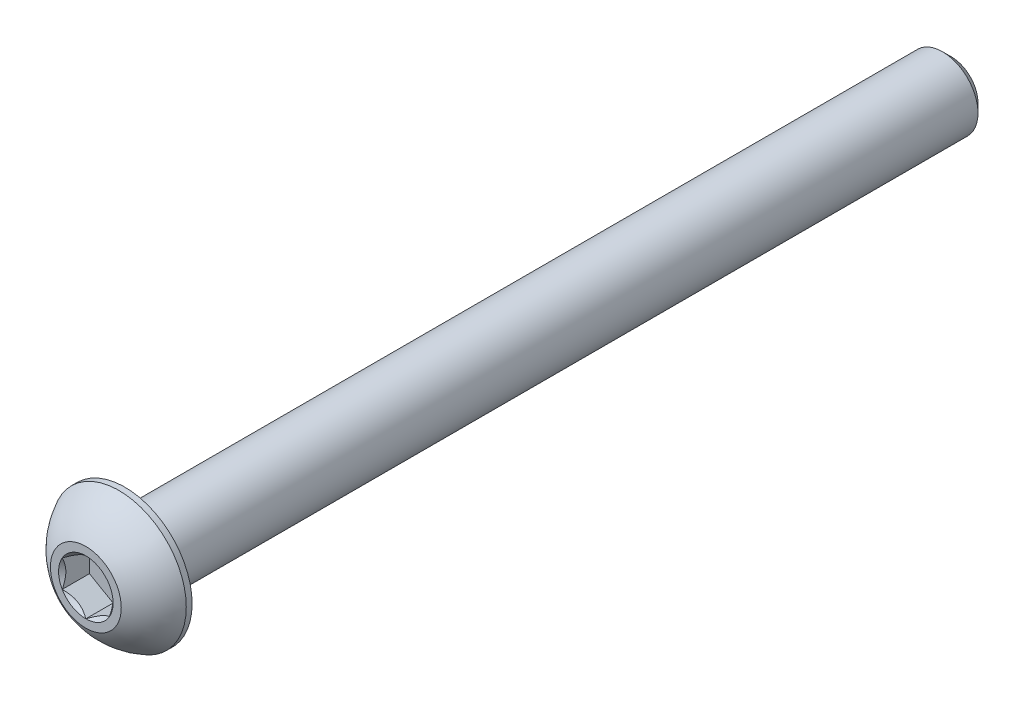
ISO-10303-21;
HEADER;
FILE_DESCRIPTION(('STEP AP214'),'2;1');
FILE_NAME('part.step','',(''),(''),'','','');
FILE_SCHEMA(('AUTOMOTIVE_DESIGN { 1 0 10303 214 1 1 1 1 }'));
ENDSEC;
DATA;
#1=APPLICATION_CONTEXT('core data for automotive mechanical design processes');
#2=APPLICATION_PROTOCOL_DEFINITION('international standard','automotive_design',2000,#1);
#3=PRODUCT_CONTEXT('',#1,'mechanical');
#4=PRODUCT('Part','Part','',(#3));
#5=PRODUCT_RELATED_PRODUCT_CATEGORY('part','',(#4));
#6=PRODUCT_DEFINITION_FORMATION('','',#4);
#7=PRODUCT_DEFINITION_CONTEXT('part definition',#1,'design');
#8=PRODUCT_DEFINITION('design','',#6,#7);
#9=PRODUCT_DEFINITION_SHAPE('','',#8);
#10=(LENGTH_UNIT() NAMED_UNIT(*) SI_UNIT(.MILLI.,.METRE.));
#11=(NAMED_UNIT(*) PLANE_ANGLE_UNIT() SI_UNIT($,.RADIAN.));
#12=(NAMED_UNIT(*) SI_UNIT($,.STERADIAN.) SOLID_ANGLE_UNIT());
#13=UNCERTAINTY_MEASURE_WITH_UNIT(LENGTH_MEASURE(1.E-05),#10,'distance_accuracy_value','');
#14=(GEOMETRIC_REPRESENTATION_CONTEXT(3) GLOBAL_UNCERTAINTY_ASSIGNED_CONTEXT((#13)) GLOBAL_UNIT_ASSIGNED_CONTEXT((#10,
#11,#12)) REPRESENTATION_CONTEXT('',''));
#15=CARTESIAN_POINT('',(0.,0.,0.));
#16=DIRECTION('',(0.,0.,1.));
#17=DIRECTION('',(1.,0.,0.));
#18=AXIS2_PLACEMENT_3D('',#15,#16,#17);
#19=CARTESIAN_POINT('',(0.,-1.15470053837925,-1.155));
#20=DIRECTION('',(0.5,-0.866025403784439,0.));
#21=DIRECTION('',(0.,0.,-1.));
#22=AXIS2_PLACEMENT_3D('',#19,#20,#21);
#23=PLANE('',#22);
#24=DIRECTION('',(0.,0.,1.));
#25=VECTOR('',#24,1.);
#26=CARTESIAN_POINT('',(0.,-1.15470053837925,-1.155));
#27=LINE('',#26,#25);
#28=CARTESIAN_POINT('',(0.,-1.15470053837925,-1.155));
#29=VERTEX_POINT('',#28);
#30=CARTESIAN_POINT('',(0.,-1.15470053837925,0.));
#31=VERTEX_POINT('',#30);
#32=EDGE_CURVE('E11',#29,#31,#27,.T.);
#33=ORIENTED_EDGE('',*,*,#32,.T.);
#34=CARTESIAN_POINT('',(0.,-1.15470053837922,0.));
#35=CARTESIAN_POINT('',(0.500000000000001,-0.866025403784439,-0.288675134594791));
#36=CARTESIAN_POINT('',(0.999999999999949,-0.577350269189654,0.));
#37=(BOUNDED_CURVE() B_SPLINE_CURVE(2,(#34,#35,#36),.UNSPECIFIED.,.F.,
.F.) B_SPLINE_CURVE_WITH_KNOTS((3,3),(-0.321867155116299,-0.124274873543865),
.UNSPECIFIED.) CURVE() GEOMETRIC_REPRESENTATION_ITEM() RATIONAL_B_SPLINE_CURVE((1.46410161513778,
1.69059892324148,1.46410161513778)) REPRESENTATION_ITEM(''));
#38=CARTESIAN_POINT('',(1.,-0.577350269189626,0.));
#39=VERTEX_POINT('',#38);
#40=EDGE_CURVE('E102',#31,#39,#37,.T.);
#41=ORIENTED_EDGE('',*,*,#40,.T.);
#42=DIRECTION('',(0.,0.,1.));
#43=VECTOR('',#42,1.);
#44=CARTESIAN_POINT('',(1.,-0.577350269189626,-1.155));
#45=LINE('',#44,#43);
#46=CARTESIAN_POINT('',(1.,-0.577350269189626,-1.155));
#47=VERTEX_POINT('',#46);
#48=EDGE_CURVE('E87',#47,#39,#45,.T.);
#49=ORIENTED_EDGE('',*,*,#48,.F.);
#50=DIRECTION('',(0.866025403784439,0.5,0.));
#51=VECTOR('',#50,1.);
#52=CARTESIAN_POINT('',(0.,-1.15470053837925,-1.155));
#53=LINE('',#52,#51);
#54=EDGE_CURVE('E107',#29,#47,#53,.T.);
#55=ORIENTED_EDGE('',*,*,#54,.F.);
#56=EDGE_LOOP('',(#33,#41,#49,#55));
#57=FACE_BOUND('',#56,.T.);
#58=ADVANCED_FACE('F17',(#57),#23,.F.);
#59=CARTESIAN_POINT('',(-1.,-0.577350269189626,-1.155));
#60=DIRECTION('',(-0.5,-0.866025403784439,0.));
#61=DIRECTION('',(-0.866025403784439,0.5,0.));
#62=AXIS2_PLACEMENT_3D('',#59,#60,#61);
#63=PLANE('',#62);
#64=DIRECTION('',(0.,0.,1.));
#65=VECTOR('',#64,1.);
#66=CARTESIAN_POINT('',(-1.,-0.577350269189626,-1.155));
#67=LINE('',#66,#65);
#68=CARTESIAN_POINT('',(-1.,-0.577350269189626,-1.155));
#69=VERTEX_POINT('',#68);
#70=CARTESIAN_POINT('',(-1.,-0.577350269189626,0.));
#71=VERTEX_POINT('',#70);
#72=EDGE_CURVE('E25',#69,#71,#67,.T.);
#73=ORIENTED_EDGE('',*,*,#72,.T.);
#74=CARTESIAN_POINT('',(-0.999999999999948,-0.577350269189655,0.));
#75=CARTESIAN_POINT('',(-0.5,-0.866025403784439,-0.28867513459479));
#76=CARTESIAN_POINT('',(0.,-1.15470053837922,0.));
#77=(BOUNDED_CURVE() B_SPLINE_CURVE(2,(#74,#75,#76),.UNSPECIFIED.,.F.,
.F.) B_SPLINE_CURVE_WITH_KNOTS((3,3),(-0.321867155116299,-0.124274873543865),
.UNSPECIFIED.) CURVE() GEOMETRIC_REPRESENTATION_ITEM() RATIONAL_B_SPLINE_CURVE((1.46410161513778,
1.69059892324148,1.46410161513778)) REPRESENTATION_ITEM(''));
#78=EDGE_CURVE('E108',#71,#31,#77,.T.);
#79=ORIENTED_EDGE('',*,*,#78,.T.);
#80=ORIENTED_EDGE('',*,*,#32,.F.);
#81=DIRECTION('',(0.866025403784439,-0.5,0.));
#82=VECTOR('',#81,1.);
#83=CARTESIAN_POINT('',(-1.,-0.577350269189626,-1.155));
#84=LINE('',#83,#82);
#85=EDGE_CURVE('E99',#69,#29,#84,.T.);
#86=ORIENTED_EDGE('',*,*,#85,.F.);
#87=EDGE_LOOP('',(#73,#79,#80,#86));
#88=FACE_BOUND('',#87,.T.);
#89=ADVANCED_FACE('F247',(#88),#63,.F.);
#90=CARTESIAN_POINT('',(-1.,0.577350269189626,-1.155));
#91=DIRECTION('',(-1.,0.,0.));
#92=DIRECTION('',(0.,0.,1.));
#93=AXIS2_PLACEMENT_3D('',#90,#91,#92);
#94=PLANE('',#93);
#95=DIRECTION('',(0.,0.,1.));
#96=VECTOR('',#95,1.);
#97=CARTESIAN_POINT('',(-1.,0.577350269189626,-1.155));
#98=LINE('',#97,#96);
#99=CARTESIAN_POINT('',(-1.,0.577350269189626,-1.155));
#100=VERTEX_POINT('',#99);
#101=CARTESIAN_POINT('',(-1.,0.577350269189626,0.));
#102=VERTEX_POINT('',#101);
#103=EDGE_CURVE('E46',#100,#102,#98,.T.);
#104=ORIENTED_EDGE('',*,*,#103,.T.);
#105=CARTESIAN_POINT('',(-1.,0.577350269189569,0.));
#106=CARTESIAN_POINT('',(-1.,0.,-0.28867513459479));
#107=CARTESIAN_POINT('',(-1.,-0.577350269189568,0.));
#108=(BOUNDED_CURVE() B_SPLINE_CURVE(2,(#105,#106,#107),.UNSPECIFIED.,.F.,
.F.) B_SPLINE_CURVE_WITH_KNOTS((3,3),(-0.3218671551163,-0.124274873543865),
.UNSPECIFIED.) CURVE() GEOMETRIC_REPRESENTATION_ITEM() RATIONAL_B_SPLINE_CURVE((1.46410161513777,
1.69059892324148,1.46410161513777)) REPRESENTATION_ITEM(''));
#109=EDGE_CURVE('E200',#102,#71,#108,.T.);
#110=ORIENTED_EDGE('',*,*,#109,.T.);
#111=ORIENTED_EDGE('',*,*,#72,.F.);
#112=DIRECTION('',(0.,-1.,0.));
#113=VECTOR('',#112,1.);
#114=CARTESIAN_POINT('',(-1.,0.577350269189626,-1.155));
#115=LINE('',#114,#113);
#116=EDGE_CURVE('E173',#100,#69,#115,.T.);
#117=ORIENTED_EDGE('',*,*,#116,.F.);
#118=EDGE_LOOP('',(#104,#110,#111,#117));
#119=FACE_BOUND('',#118,.T.);
#120=ADVANCED_FACE('F251',(#119),#94,.F.);
#121=CARTESIAN_POINT('',(0.,1.15470053837925,-1.155));
#122=DIRECTION('',(-0.5,0.866025403784439,0.));
#123=DIRECTION('',(0.,0.,1.));
#124=AXIS2_PLACEMENT_3D('',#121,#122,#123);
#125=PLANE('',#124);
#126=DIRECTION('',(0.,0.,1.));
#127=VECTOR('',#126,1.);
#128=CARTESIAN_POINT('',(0.,1.15470053837925,-1.155));
#129=LINE('',#128,#127);
#130=CARTESIAN_POINT('',(0.,1.15470053837925,-1.155));
#131=VERTEX_POINT('',#130);
#132=CARTESIAN_POINT('',(0.,1.15470053837925,0.));
#133=VERTEX_POINT('',#132);
#134=EDGE_CURVE('E238',#131,#133,#129,.T.);
#135=ORIENTED_EDGE('',*,*,#134,.T.);
#136=CARTESIAN_POINT('',(0.,1.15470053837922,0.));
#137=CARTESIAN_POINT('',(-0.500000000000001,0.866025403784439,-0.288675134594791));
#138=CARTESIAN_POINT('',(-0.999999999999951,0.577350269189654,0.));
#139=(BOUNDED_CURVE() B_SPLINE_CURVE(2,(#136,#137,#138),.UNSPECIFIED.,.F.,
.F.) B_SPLINE_CURVE_WITH_KNOTS((3,3),(-0.3218671551163,-0.124274873543865),
.UNSPECIFIED.) CURVE() GEOMETRIC_REPRESENTATION_ITEM() RATIONAL_B_SPLINE_CURVE((1.46410161513778,
1.69059892324148,1.46410161513778)) REPRESENTATION_ITEM(''));
#140=EDGE_CURVE('E184',#133,#102,#139,.T.);
#141=ORIENTED_EDGE('',*,*,#140,.T.);
#142=ORIENTED_EDGE('',*,*,#103,.F.);
#143=DIRECTION('',(-0.866025403784439,-0.5,0.));
#144=VECTOR('',#143,1.);
#145=CARTESIAN_POINT('',(0.,1.15470053837925,-1.155));
#146=LINE('',#145,#144);
#147=EDGE_CURVE('E169',#131,#100,#146,.T.);
#148=ORIENTED_EDGE('',*,*,#147,.F.);
#149=EDGE_LOOP('',(#135,#141,#142,#148));
#150=FACE_BOUND('',#149,.T.);
#151=ADVANCED_FACE('F274',(#150),#125,.F.);
#152=CARTESIAN_POINT('',(1.,0.577350269189626,-1.155));
#153=DIRECTION('',(0.5,0.866025403784439,0.));
#154=DIRECTION('',(0.,0.,-1.));
#155=AXIS2_PLACEMENT_3D('',#152,#153,#154);
#156=PLANE('',#155);
#157=DIRECTION('',(0.,0.,1.));
#158=VECTOR('',#157,1.);
#159=CARTESIAN_POINT('',(1.,0.577350269189626,-1.155));
#160=LINE('',#159,#158);
#161=CARTESIAN_POINT('',(1.,0.577350269189626,-1.155));
#162=VERTEX_POINT('',#161);
#163=CARTESIAN_POINT('',(1.,0.577350269189626,0.));
#164=VERTEX_POINT('',#163);
#165=EDGE_CURVE('E98',#162,#164,#160,.T.);
#166=ORIENTED_EDGE('',*,*,#165,.T.);
#167=CARTESIAN_POINT('',(0.999999999999952,0.577350269189653,0.));
#168=CARTESIAN_POINT('',(0.5,0.866025403784439,-0.288675134594791));
#169=CARTESIAN_POINT('',(0.,1.15470053837922,0.));
#170=(BOUNDED_CURVE() B_SPLINE_CURVE(2,(#167,#168,#169),.UNSPECIFIED.,.F.,
.F.) B_SPLINE_CURVE_WITH_KNOTS((3,3),(-0.3218671551163,-0.124274873543865),
.UNSPECIFIED.) CURVE() GEOMETRIC_REPRESENTATION_ITEM() RATIONAL_B_SPLINE_CURVE((1.46410161513778,
1.69059892324148,1.46410161513778)) REPRESENTATION_ITEM(''));
#171=EDGE_CURVE('E178',#164,#133,#170,.T.);
#172=ORIENTED_EDGE('',*,*,#171,.T.);
#173=ORIENTED_EDGE('',*,*,#134,.F.);
#174=DIRECTION('',(-0.866025403784439,0.5,0.));
#175=VECTOR('',#174,1.);
#176=CARTESIAN_POINT('',(1.,0.577350269189626,-1.155));
#177=LINE('',#176,#175);
#178=EDGE_CURVE('E174',#162,#131,#177,.T.);
#179=ORIENTED_EDGE('',*,*,#178,.F.);
#180=EDGE_LOOP('',(#166,#172,#173,#179));
#181=FACE_BOUND('',#180,.T.);
#182=ADVANCED_FACE('F278',(#181),#156,.F.);
#183=CARTESIAN_POINT('',(1.,-0.577350269189626,-1.155));
#184=DIRECTION('',(1.,0.,0.));
#185=DIRECTION('',(0.,1.,0.));
#186=AXIS2_PLACEMENT_3D('',#183,#184,#185);
#187=PLANE('',#186);
#188=ORIENTED_EDGE('',*,*,#48,.T.);
#189=CARTESIAN_POINT('',(1.,-0.577350269189568,0.));
#190=CARTESIAN_POINT('',(1.,0.,-0.28867513459479));
#191=CARTESIAN_POINT('',(1.,0.577350269189568,0.));
#192=(BOUNDED_CURVE() B_SPLINE_CURVE(2,(#189,#190,#191),.UNSPECIFIED.,.F.,
.F.) B_SPLINE_CURVE_WITH_KNOTS((3,3),(-0.321867155116299,-0.124274873543865),
.UNSPECIFIED.) CURVE() GEOMETRIC_REPRESENTATION_ITEM() RATIONAL_B_SPLINE_CURVE((1.46410161513777,
1.69059892324148,1.46410161513777)) REPRESENTATION_ITEM(''));
#193=EDGE_CURVE('E91',#39,#164,#192,.T.);
#194=ORIENTED_EDGE('',*,*,#193,.T.);
#195=ORIENTED_EDGE('',*,*,#165,.F.);
#196=DIRECTION('',(0.,1.,0.));
#197=VECTOR('',#196,1.);
#198=CARTESIAN_POINT('',(1.,-0.577350269189626,-1.155));
#199=LINE('',#198,#197);
#200=EDGE_CURVE('E93',#47,#162,#199,.T.);
#201=ORIENTED_EDGE('',*,*,#200,.F.);
#202=EDGE_LOOP('',(#188,#194,#195,#201));
#203=FACE_BOUND('',#202,.T.);
#204=ADVANCED_FACE('F89',(#203),#187,.F.);
#205=CARTESIAN_POINT('',(1.,-0.577350269189625,-1.155));
#206=DIRECTION('',(0.,0.,1.));
#207=DIRECTION('',(1.,0.,0.));
#208=AXIS2_PLACEMENT_3D('',#205,#206,#207);
#209=PLANE('',#208);
#210=ORIENTED_EDGE('',*,*,#54,.T.);
#211=ORIENTED_EDGE('',*,*,#200,.T.);
#212=ORIENTED_EDGE('',*,*,#178,.T.);
#213=ORIENTED_EDGE('',*,*,#147,.T.);
#214=ORIENTED_EDGE('',*,*,#116,.T.);
#215=ORIENTED_EDGE('',*,*,#85,.T.);
#216=EDGE_LOOP('',(#210,#211,#212,#213,#214,#215));
#217=FACE_BOUND('',#216,.T.);
#218=ADVANCED_FACE('F296',(#217),#209,.T.);
#219=CARTESIAN_POINT('',(0.,0.,0.));
#220=DIRECTION('',(0.,0.,1.));
#221=DIRECTION('',(1.,0.,0.));
#222=AXIS2_PLACEMENT_3D('',#219,#220,#221);
#223=CONICAL_SURFACE('',#222,1.15470053837925,0.78539816339745);
#224=CARTESIAN_POINT('',(0.,0.,0.));
#225=DIRECTION('',(0.,0.,1.));
#226=DIRECTION('',(1.,0.,0.));
#227=AXIS2_PLACEMENT_3D('',#224,#225,#226);
#228=CIRCLE('',#227,1.15470053837925);
#229=EDGE_CURVE('E111',#31,#39,#228,.T.);
#230=ORIENTED_EDGE('',*,*,#229,.T.);
#231=ORIENTED_EDGE('',*,*,#40,.F.);
#232=EDGE_LOOP('',(#230,#231));
#233=FACE_BOUND('',#232,.T.);
#234=ADVANCED_FACE('F113',(#233),#223,.F.);
#235=CARTESIAN_POINT('',(0.,0.,0.));
#236=DIRECTION('',(0.,0.,1.));
#237=DIRECTION('',(1.,0.,0.));
#238=AXIS2_PLACEMENT_3D('',#235,#236,#237);
#239=CONICAL_SURFACE('',#238,1.15470053837925,0.78539816339745);
#240=CARTESIAN_POINT('',(0.,0.,0.));
#241=DIRECTION('',(0.,0.,1.));
#242=DIRECTION('',(1.,0.,0.));
#243=AXIS2_PLACEMENT_3D('',#240,#241,#242);
#244=CIRCLE('',#243,1.15470053837925);
#245=EDGE_CURVE('E117',#71,#31,#244,.T.);
#246=ORIENTED_EDGE('',*,*,#245,.T.);
#247=ORIENTED_EDGE('',*,*,#78,.F.);
#248=EDGE_LOOP('',(#246,#247));
#249=FACE_BOUND('',#248,.T.);
#250=ADVANCED_FACE('F249',(#249),#239,.F.);
#251=CARTESIAN_POINT('',(0.,0.,0.));
#252=DIRECTION('',(0.,0.,1.));
#253=DIRECTION('',(-1.,0.,0.));
#254=AXIS2_PLACEMENT_3D('',#251,#252,#253);
#255=CONICAL_SURFACE('',#254,1.15470053837925,0.78539816339745);
#256=CARTESIAN_POINT('',(0.,0.,0.));
#257=DIRECTION('',(0.,0.,1.));
#258=DIRECTION('',(1.,0.,0.));
#259=AXIS2_PLACEMENT_3D('',#256,#257,#258);
#260=CIRCLE('',#259,1.15470053837925);
#261=EDGE_CURVE('E153',#102,#71,#260,.T.);
#262=ORIENTED_EDGE('',*,*,#261,.T.);
#263=ORIENTED_EDGE('',*,*,#109,.F.);
#264=EDGE_LOOP('',(#262,#263));
#265=FACE_BOUND('',#264,.T.);
#266=ADVANCED_FACE('F253',(#265),#255,.F.);
#267=CARTESIAN_POINT('',(0.,0.,0.));
#268=DIRECTION('',(0.,0.,1.));
#269=DIRECTION('',(1.,0.,0.));
#270=AXIS2_PLACEMENT_3D('',#267,#268,#269);
#271=CONICAL_SURFACE('',#270,1.15470053837925,0.78539816339745);
#272=CARTESIAN_POINT('',(0.,0.,0.));
#273=DIRECTION('',(0.,0.,1.));
#274=DIRECTION('',(1.,0.,0.));
#275=AXIS2_PLACEMENT_3D('',#272,#273,#274);
#276=CIRCLE('',#275,1.15470053837925);
#277=EDGE_CURVE('E149',#133,#102,#276,.T.);
#278=ORIENTED_EDGE('',*,*,#277,.T.);
#279=ORIENTED_EDGE('',*,*,#140,.F.);
#280=EDGE_LOOP('',(#278,#279));
#281=FACE_BOUND('',#280,.T.);
#282=ADVANCED_FACE('F255',(#281),#271,.F.);
#283=CARTESIAN_POINT('',(0.,0.,0.));
#284=DIRECTION('',(0.,0.,1.));
#285=DIRECTION('',(1.,0.,0.));
#286=AXIS2_PLACEMENT_3D('',#283,#284,#285);
#287=CONICAL_SURFACE('',#286,1.15470053837925,0.78539816339745);
#288=CARTESIAN_POINT('',(0.,0.,0.));
#289=DIRECTION('',(0.,0.,1.));
#290=DIRECTION('',(1.,0.,0.));
#291=AXIS2_PLACEMENT_3D('',#288,#289,#290);
#292=CIRCLE('',#291,1.15470053837925);
#293=EDGE_CURVE('E118',#164,#133,#292,.T.);
#294=ORIENTED_EDGE('',*,*,#293,.T.);
#295=ORIENTED_EDGE('',*,*,#171,.F.);
#296=EDGE_LOOP('',(#294,#295));
#297=FACE_BOUND('',#296,.T.);
#298=ADVANCED_FACE('F262',(#297),#287,.F.);
#299=CARTESIAN_POINT('',(0.,-2.85,-1.65));
#300=DIRECTION('',(0.,0.,1.));
#301=DIRECTION('',(1.,0.,0.));
#302=AXIS2_PLACEMENT_3D('',#299,#300,#301);
#303=PLANE('',#302);
#304=CARTESIAN_POINT('',(0.,0.,-1.65));
#305=DIRECTION('',(0.,0.,-1.));
#306=DIRECTION('',(1.,0.,0.));
#307=AXIS2_PLACEMENT_3D('',#304,#305,#306);
#308=CIRCLE('',#307,1.5);
#309=CARTESIAN_POINT('',(1.5,0.,-1.65));
#310=VERTEX_POINT('',#309);
#311=EDGE_CURVE('E160',#310,#310,#308,.T.);
#312=ORIENTED_EDGE('',*,*,#311,.F.);
#313=EDGE_LOOP('',(#312));
#314=FACE_BOUND('',#313,.T.);
#315=CARTESIAN_POINT('',(0.,0.,-1.65));
#316=DIRECTION('',(0.,0.,1.));
#317=DIRECTION('',(1.,0.,0.));
#318=AXIS2_PLACEMENT_3D('',#315,#316,#317);
#319=CIRCLE('',#318,2.85);
#320=CARTESIAN_POINT('',(2.85,0.,-1.65));
#321=VERTEX_POINT('',#320);
#322=EDGE_CURVE('E141',#321,#321,#319,.T.);
#323=ORIENTED_EDGE('',*,*,#322,.F.);
#324=EDGE_LOOP('',(#323));
#325=FACE_BOUND('',#324,.T.);
#326=ADVANCED_FACE('F289',(#314,#325),#303,.F.);
#327=CARTESIAN_POINT('',(0.,-1.5,0.));
#328=DIRECTION('',(0.,0.,-1.));
#329=DIRECTION('',(0.,-1.,0.));
#330=AXIS2_PLACEMENT_3D('',#327,#328,#329);
#331=PLANE('',#330);
#332=ORIENTED_EDGE('',*,*,#261,.F.);
#333=ORIENTED_EDGE('',*,*,#277,.F.);
#334=ORIENTED_EDGE('',*,*,#293,.F.);
#335=CARTESIAN_POINT('',(0.,0.,0.));
#336=DIRECTION('',(0.,0.,1.));
#337=DIRECTION('',(1.,0.,0.));
#338=AXIS2_PLACEMENT_3D('',#335,#336,#337);
#339=CIRCLE('',#338,1.15470053837925);
#340=EDGE_CURVE('E122',#39,#164,#339,.T.);
#341=ORIENTED_EDGE('',*,*,#340,.F.);
#342=ORIENTED_EDGE('',*,*,#229,.F.);
#343=ORIENTED_EDGE('',*,*,#245,.F.);
#344=EDGE_LOOP('',(#332,#333,#334,#341,#342,#343));
#345=FACE_BOUND('',#344,.T.);
#346=CARTESIAN_POINT('',(0.,0.,0.));
#347=DIRECTION('',(0.,0.,1.));
#348=DIRECTION('',(1.,0.,0.));
#349=AXIS2_PLACEMENT_3D('',#346,#347,#348);
#350=CIRCLE('',#349,1.5);
#351=CARTESIAN_POINT('',(1.5,0.,0.));
#352=VERTEX_POINT('',#351);
#353=EDGE_CURVE('E147',#352,#352,#350,.T.);
#354=ORIENTED_EDGE('',*,*,#353,.T.);
#355=EDGE_LOOP('',(#354));
#356=FACE_BOUND('',#355,.T.);
#357=ADVANCED_FACE('F124',(#345,#356),#331,.F.);
#358=CARTESIAN_POINT('',(0.,-1.5,-36.65));
#359=DIRECTION('',(0.,0.,-1.));
#360=DIRECTION('',(-1.,0.,0.));
#361=AXIS2_PLACEMENT_3D('',#358,#359,#360);
#362=PLANE('',#361);
#363=CARTESIAN_POINT('',(0.,0.,-36.65));
#364=DIRECTION('',(0.,0.,-1.));
#365=DIRECTION('',(0.,1.,0.));
#366=AXIS2_PLACEMENT_3D('',#363,#364,#365);
#367=CIRCLE('',#366,1.125);
#368=CARTESIAN_POINT('',(0.,1.125,-36.65));
#369=VERTEX_POINT('',#368);
#370=EDGE_CURVE('E167',#369,#369,#367,.T.);
#371=ORIENTED_EDGE('',*,*,#370,.T.);
#372=EDGE_LOOP('',(#371));
#373=FACE_BOUND('',#372,.T.);
#374=ADVANCED_FACE('F315',(#373),#362,.T.);
#375=CARTESIAN_POINT('',(0.,0.,-36.65));
#376=DIRECTION('',(0.,0.,-1.));
#377=DIRECTION('',(0.,1.,0.));
#378=AXIS2_PLACEMENT_3D('',#375,#376,#377);
#379=CYLINDRICAL_SURFACE('',#378,1.5);
#380=ORIENTED_EDGE('',*,*,#311,.T.);
#381=EDGE_LOOP('',(#380));
#382=FACE_BOUND('',#381,.T.);
#383=CARTESIAN_POINT('',(0.,0.,-36.275));
#384=DIRECTION('',(0.,0.,1.));
#385=DIRECTION('',(0.,1.,0.));
#386=AXIS2_PLACEMENT_3D('',#383,#384,#385);
#387=CIRCLE('',#386,1.5);
#388=CARTESIAN_POINT('',(0.,1.5,-36.275));
#389=VERTEX_POINT('',#388);
#390=EDGE_CURVE('E164',#389,#389,#387,.T.);
#391=ORIENTED_EDGE('',*,*,#390,.T.);
#392=EDGE_LOOP('',(#391));
#393=FACE_BOUND('',#392,.T.);
#394=ADVANCED_FACE('F318',(#382,#393),#379,.T.);
#395=CARTESIAN_POINT('',(0.,0.,-36.65));
#396=DIRECTION('',(0.,0.,1.));
#397=DIRECTION('',(0.,-1.,0.));
#398=AXIS2_PLACEMENT_3D('',#395,#396,#397);
#399=CONICAL_SURFACE('',#398,1.125,0.78539816339745);
#400=ORIENTED_EDGE('',*,*,#370,.F.);
#401=EDGE_LOOP('',(#400));
#402=FACE_BOUND('',#401,.T.);
#403=ORIENTED_EDGE('',*,*,#390,.F.);
#404=EDGE_LOOP('',(#403));
#405=FACE_BOUND('',#404,.T.);
#406=ADVANCED_FACE('F322',(#402,#405),#399,.T.);
#407=CARTESIAN_POINT('',(0.,0.,-2.79483288770053));
#408=DIRECTION('',(1.,0.,0.));
#409=DIRECTION('',(0.,-1.,0.));
#410=AXIS2_PLACEMENT_3D('',#407,#408,#409);
#411=SPHERICAL_SURFACE('',#410,3.17192226735973);
#412=CARTESIAN_POINT('',(0.,0.,-2.79483288770053));
#413=DIRECTION('',(0.,0.,1.));
#414=DIRECTION('',(1.,0.,0.));
#415=AXIS2_PLACEMENT_3D('',#412,#413,#414);
#416=SPHERICAL_SURFACE('',#415,3.17192226735973);
#417=ORIENTED_EDGE('',*,*,#353,.F.);
#418=EDGE_LOOP('',(#417));
#419=FACE_BOUND('',#418,.T.);
#420=CARTESIAN_POINT('',(0.,0.,-1.4025));
#421=DIRECTION('',(0.,0.,1.));
#422=DIRECTION('',(1.,0.,0.));
#423=AXIS2_PLACEMENT_3D('',#420,#421,#422);
#424=CIRCLE('',#423,2.85);
#425=CARTESIAN_POINT('',(2.85,0.,-1.4025));
#426=VERTEX_POINT('',#425);
#427=EDGE_CURVE('E130',#426,#426,#424,.T.);
#428=ORIENTED_EDGE('',*,*,#427,.T.);
#429=EDGE_LOOP('',(#428));
#430=FACE_BOUND('',#429,.T.);
#431=ADVANCED_FACE('F313',(#419,#430),#416,.T.);
#432=CARTESIAN_POINT('',(0.,0.,0.));
#433=DIRECTION('',(0.,0.,1.));
#434=DIRECTION('',(1.,0.,0.));
#435=AXIS2_PLACEMENT_3D('',#432,#433,#434);
#436=CYLINDRICAL_SURFACE('',#435,2.85);
#437=ORIENTED_EDGE('',*,*,#322,.T.);
#438=EDGE_LOOP('',(#437));
#439=FACE_BOUND('',#438,.T.);
#440=ORIENTED_EDGE('',*,*,#427,.F.);
#441=EDGE_LOOP('',(#440));
#442=FACE_BOUND('',#441,.T.);
#443=ADVANCED_FACE('F310',(#439,#442),#436,.T.);
#444=CARTESIAN_POINT('',(0.,0.,0.));
#445=DIRECTION('',(0.,0.,1.));
#446=DIRECTION('',(1.,0.,0.));
#447=AXIS2_PLACEMENT_3D('',#444,#445,#446);
#448=CONICAL_SURFACE('',#447,1.15470053837925,0.78539816339745);
#449=ORIENTED_EDGE('',*,*,#193,.F.);
#450=ORIENTED_EDGE('',*,*,#340,.T.);
#451=EDGE_LOOP('',(#449,#450));
#452=FACE_BOUND('',#451,.T.);
#453=ADVANCED_FACE('F132',(#452),#448,.F.);
#454=CLOSED_SHELL('',(#58,#89,#120,#151,#182,#204,#218,#234,#250,#266,#282,#298,#326,#357,#374,
#394,#406,#431,#443,#453));
#455=MANIFOLD_SOLID_BREP('B1',#454);
#456=ADVANCED_BREP_SHAPE_REPRESENTATION('',(#18,#455),#14);
#457=SHAPE_DEFINITION_REPRESENTATION(#9,#456);
ENDSEC;
END-ISO-10303-21;
